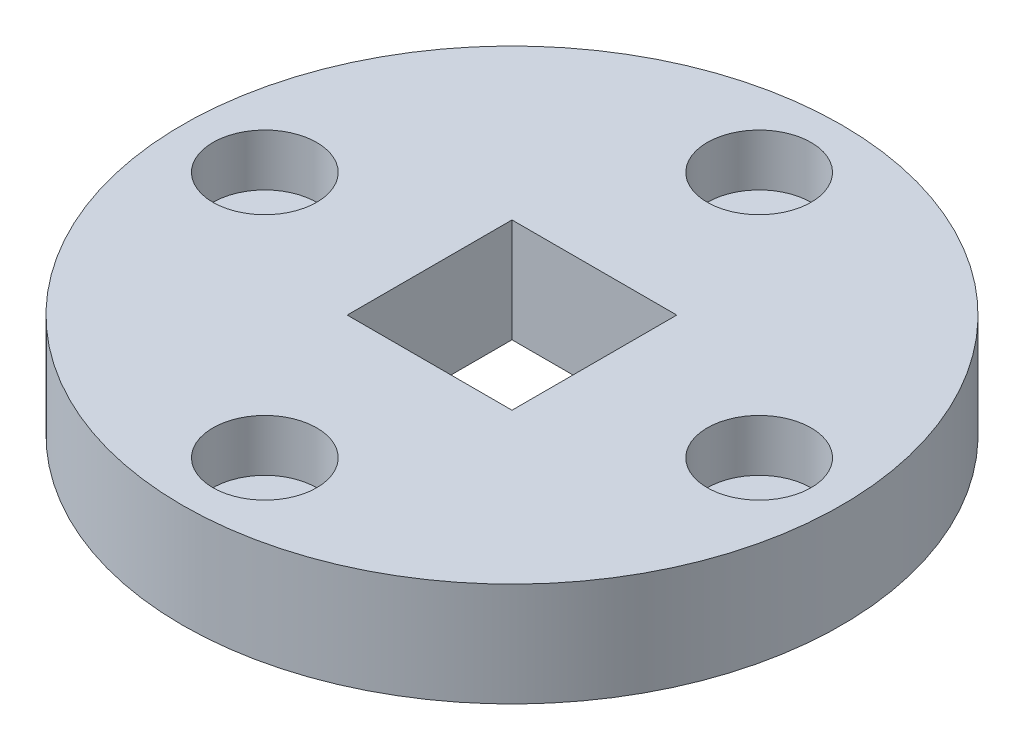
ISO-10303-21;
HEADER;
FILE_DESCRIPTION(('STEP AP214'),'2;1');
FILE_NAME('part.step','',(''),(''),'','','');
FILE_SCHEMA(('AUTOMOTIVE_DESIGN { 1 0 10303 214 1 1 1 1 }'));
ENDSEC;
DATA;
#1=APPLICATION_CONTEXT('core data for automotive mechanical design processes');
#2=APPLICATION_PROTOCOL_DEFINITION('international standard','automotive_design',2000,#1);
#3=PRODUCT_CONTEXT('',#1,'mechanical');
#4=PRODUCT('Part','Part','',(#3));
#5=PRODUCT_RELATED_PRODUCT_CATEGORY('part','',(#4));
#6=PRODUCT_DEFINITION_FORMATION('','',#4);
#7=PRODUCT_DEFINITION_CONTEXT('part definition',#1,'design');
#8=PRODUCT_DEFINITION('design','',#6,#7);
#9=PRODUCT_DEFINITION_SHAPE('','',#8);
#10=(LENGTH_UNIT() NAMED_UNIT(*) SI_UNIT(.MILLI.,.METRE.));
#11=(NAMED_UNIT(*) PLANE_ANGLE_UNIT() SI_UNIT($,.RADIAN.));
#12=(NAMED_UNIT(*) SI_UNIT($,.STERADIAN.) SOLID_ANGLE_UNIT());
#13=UNCERTAINTY_MEASURE_WITH_UNIT(LENGTH_MEASURE(1.E-05),#10,'distance_accuracy_value','');
#14=(GEOMETRIC_REPRESENTATION_CONTEXT(3) GLOBAL_UNCERTAINTY_ASSIGNED_CONTEXT((#13)) GLOBAL_UNIT_ASSIGNED_CONTEXT((#10,
#11,#12)) REPRESENTATION_CONTEXT('',''));
#15=CARTESIAN_POINT('',(0.,0.,0.));
#16=DIRECTION('',(0.,0.,1.));
#17=DIRECTION('',(1.,0.,0.));
#18=AXIS2_PLACEMENT_3D('',#15,#16,#17);
#19=CARTESIAN_POINT('',(0.,2.,0.));
#20=DIRECTION('',(0.,1.,0.));
#21=DIRECTION('',(0.,0.,1.));
#22=AXIS2_PLACEMENT_3D('',#19,#20,#21);
#23=PLANE('',#22);
#24=CARTESIAN_POINT('',(0.,2.,-4.7625));
#25=DIRECTION('',(0.,1.,0.));
#26=DIRECTION('',(-1.,0.,0.));
#27=AXIS2_PLACEMENT_3D('',#24,#25,#26);
#28=CIRCLE('',#27,1.);
#29=CARTESIAN_POINT('',(-0.999999999999984,2.,-4.7625));
#30=VERTEX_POINT('',#29);
#31=EDGE_CURVE('E236',#30,#30,#28,.T.);
#32=ORIENTED_EDGE('',*,*,#31,.F.);
#33=EDGE_LOOP('',(#32));
#34=FACE_BOUND('',#33,.T.);
#35=CARTESIAN_POINT('',(4.7625,2.,0.));
#36=DIRECTION('',(0.,1.,0.));
#37=DIRECTION('',(0.,0.,-1.));
#38=AXIS2_PLACEMENT_3D('',#35,#36,#37);
#39=CIRCLE('',#38,1.);
#40=CARTESIAN_POINT('',(4.7625,2.,-1.));
#41=VERTEX_POINT('',#40);
#42=EDGE_CURVE('E245',#41,#41,#39,.T.);
#43=ORIENTED_EDGE('',*,*,#42,.F.);
#44=EDGE_LOOP('',(#43));
#45=FACE_BOUND('',#44,.T.);
#46=CARTESIAN_POINT('',(0.,2.,4.7625));
#47=DIRECTION('',(0.,1.,0.));
#48=DIRECTION('',(1.,0.,0.));
#49=AXIS2_PLACEMENT_3D('',#46,#47,#48);
#50=CIRCLE('',#49,1.);
#51=CARTESIAN_POINT('',(0.99999999999995,2.,4.76250000000001));
#52=VERTEX_POINT('',#51);
#53=EDGE_CURVE('E251',#52,#52,#50,.T.);
#54=ORIENTED_EDGE('',*,*,#53,.F.);
#55=EDGE_LOOP('',(#54));
#56=FACE_BOUND('',#55,.T.);
#57=CARTESIAN_POINT('',(-4.7625,2.,0.));
#58=DIRECTION('',(0.,1.,0.));
#59=DIRECTION('',(0.,0.,1.));
#60=AXIS2_PLACEMENT_3D('',#57,#58,#59);
#61=CIRCLE('',#60,1.);
#62=CARTESIAN_POINT('',(-4.7625,2.,1.));
#63=VERTEX_POINT('',#62);
#64=EDGE_CURVE('E235',#63,#63,#61,.T.);
#65=ORIENTED_EDGE('',*,*,#64,.F.);
#66=EDGE_LOOP('',(#65));
#67=FACE_BOUND('',#66,.T.);
#68=CARTESIAN_POINT('',(0.,2.,0.));
#69=DIRECTION('',(0.,1.,0.));
#70=DIRECTION('',(0.,0.,1.));
#71=AXIS2_PLACEMENT_3D('',#68,#69,#70);
#72=CIRCLE('',#71,6.35);
#73=CARTESIAN_POINT('',(0.,2.,6.35));
#74=VERTEX_POINT('',#73);
#75=EDGE_CURVE('E11',#74,#74,#72,.T.);
#76=ORIENTED_EDGE('',*,*,#75,.T.);
#77=EDGE_LOOP('',(#76));
#78=FACE_BOUND('',#77,.T.);
#79=DIRECTION('',(-1.,0.,0.));
#80=VECTOR('',#79,1.);
#81=CARTESIAN_POINT('',(-1.5875,2.,-1.5875));
#82=LINE('',#81,#80);
#83=CARTESIAN_POINT('',(1.5875,2.,-1.5875));
#84=VERTEX_POINT('',#83);
#85=CARTESIAN_POINT('',(-1.5875,2.,-1.5875));
#86=VERTEX_POINT('',#85);
#87=EDGE_CURVE('E82',#84,#86,#82,.T.);
#88=ORIENTED_EDGE('',*,*,#87,.F.);
#89=DIRECTION('',(0.,0.,-1.));
#90=VECTOR('',#89,1.);
#91=CARTESIAN_POINT('',(1.5875,2.,1.5875));
#92=LINE('',#91,#90);
#93=CARTESIAN_POINT('',(1.5875,2.,1.5875));
#94=VERTEX_POINT('',#93);
#95=EDGE_CURVE('E74',#94,#84,#92,.T.);
#96=ORIENTED_EDGE('',*,*,#95,.F.);
#97=DIRECTION('',(1.,0.,0.));
#98=VECTOR('',#97,1.);
#99=CARTESIAN_POINT('',(-1.5875,2.,1.5875));
#100=LINE('',#99,#98);
#101=CARTESIAN_POINT('',(-1.5875,2.,1.5875));
#102=VERTEX_POINT('',#101);
#103=EDGE_CURVE('E95',#102,#94,#100,.T.);
#104=ORIENTED_EDGE('',*,*,#103,.F.);
#105=DIRECTION('',(0.,0.,1.));
#106=VECTOR('',#105,1.);
#107=CARTESIAN_POINT('',(-1.5875,2.,1.5875));
#108=LINE('',#107,#106);
#109=EDGE_CURVE('E93',#86,#102,#108,.T.);
#110=ORIENTED_EDGE('',*,*,#109,.F.);
#111=EDGE_LOOP('',(#88,#96,#104,#110));
#112=FACE_BOUND('',#111,.T.);
#113=ADVANCED_FACE('F33',(#34,#45,#56,#67,#78,#112),#23,.T.);
#114=CARTESIAN_POINT('',(0.,0.,0.));
#115=DIRECTION('',(0.,1.,0.));
#116=DIRECTION('',(0.,0.,1.));
#117=AXIS2_PLACEMENT_3D('',#114,#115,#116);
#118=PLANE('',#117);
#119=CARTESIAN_POINT('',(0.,0.,0.));
#120=DIRECTION('',(0.,1.,0.));
#121=DIRECTION('',(0.,0.,1.));
#122=AXIS2_PLACEMENT_3D('',#119,#120,#121);
#123=CIRCLE('',#122,6.35);
#124=CARTESIAN_POINT('',(0.,0.,6.35));
#125=VERTEX_POINT('',#124);
#126=EDGE_CURVE('E37',#125,#125,#123,.T.);
#127=ORIENTED_EDGE('',*,*,#126,.F.);
#128=EDGE_LOOP('',(#127));
#129=FACE_BOUND('',#128,.T.);
#130=DIRECTION('',(0.,0.,-1.));
#131=VECTOR('',#130,1.);
#132=CARTESIAN_POINT('',(1.5875,0.,1.5875));
#133=LINE('',#132,#131);
#134=CARTESIAN_POINT('',(1.5875,0.,1.5875));
#135=VERTEX_POINT('',#134);
#136=CARTESIAN_POINT('',(1.5875,0.,-1.5875));
#137=VERTEX_POINT('',#136);
#138=EDGE_CURVE('E56',#135,#137,#133,.T.);
#139=ORIENTED_EDGE('',*,*,#138,.T.);
#140=DIRECTION('',(-1.,0.,0.));
#141=VECTOR('',#140,1.);
#142=CARTESIAN_POINT('',(-1.5875,0.,-1.5875));
#143=LINE('',#142,#141);
#144=CARTESIAN_POINT('',(-1.5875,0.,-1.5875));
#145=VERTEX_POINT('',#144);
#146=EDGE_CURVE('E89',#137,#145,#143,.T.);
#147=ORIENTED_EDGE('',*,*,#146,.T.);
#148=DIRECTION('',(0.,0.,1.));
#149=VECTOR('',#148,1.);
#150=CARTESIAN_POINT('',(-1.5875,0.,1.5875));
#151=LINE('',#150,#149);
#152=CARTESIAN_POINT('',(-1.5875,0.,1.5875));
#153=VERTEX_POINT('',#152);
#154=EDGE_CURVE('E103',#145,#153,#151,.T.);
#155=ORIENTED_EDGE('',*,*,#154,.T.);
#156=DIRECTION('',(1.,0.,0.));
#157=VECTOR('',#156,1.);
#158=CARTESIAN_POINT('',(-1.5875,0.,1.5875));
#159=LINE('',#158,#157);
#160=EDGE_CURVE('E83',#153,#135,#159,.T.);
#161=ORIENTED_EDGE('',*,*,#160,.T.);
#162=EDGE_LOOP('',(#139,#147,#155,#161));
#163=FACE_BOUND('',#162,.T.);
#164=ADVANCED_FACE('F114',(#129,#163),#118,.F.);
#165=CARTESIAN_POINT('',(0.,2.,0.));
#166=DIRECTION('',(0.,-1.,0.));
#167=DIRECTION('',(0.,0.,-1.));
#168=AXIS2_PLACEMENT_3D('',#165,#166,#167);
#169=CYLINDRICAL_SURFACE('',#168,6.35);
#170=ORIENTED_EDGE('',*,*,#75,.F.);
#171=EDGE_LOOP('',(#170));
#172=FACE_BOUND('',#171,.T.);
#173=ORIENTED_EDGE('',*,*,#126,.T.);
#174=EDGE_LOOP('',(#173));
#175=FACE_BOUND('',#174,.T.);
#176=ADVANCED_FACE('F35',(#172,#175),#169,.T.);
#177=CARTESIAN_POINT('',(1.5875,2.,1.5875));
#178=DIRECTION('',(-1.,0.,0.));
#179=DIRECTION('',(0.,0.,1.));
#180=AXIS2_PLACEMENT_3D('',#177,#178,#179);
#181=PLANE('',#180);
#182=ORIENTED_EDGE('',*,*,#138,.F.);
#183=DIRECTION('',(0.,-1.,0.));
#184=VECTOR('',#183,1.);
#185=CARTESIAN_POINT('',(1.5875,2.,1.5875));
#186=LINE('',#185,#184);
#187=EDGE_CURVE('E78',#94,#135,#186,.T.);
#188=ORIENTED_EDGE('',*,*,#187,.F.);
#189=ORIENTED_EDGE('',*,*,#95,.T.);
#190=DIRECTION('',(0.,-1.,0.));
#191=VECTOR('',#190,1.);
#192=CARTESIAN_POINT('',(1.5875,2.,-1.5875));
#193=LINE('',#192,#191);
#194=EDGE_CURVE('E77',#84,#137,#193,.T.);
#195=ORIENTED_EDGE('',*,*,#194,.T.);
#196=EDGE_LOOP('',(#182,#188,#189,#195));
#197=FACE_BOUND('',#196,.T.);
#198=ADVANCED_FACE('F76',(#197),#181,.T.);
#199=CARTESIAN_POINT('',(-1.5875,2.,-1.5875));
#200=DIRECTION('',(0.,0.,1.));
#201=DIRECTION('',(1.,0.,0.));
#202=AXIS2_PLACEMENT_3D('',#199,#200,#201);
#203=PLANE('',#202);
#204=ORIENTED_EDGE('',*,*,#146,.F.);
#205=ORIENTED_EDGE('',*,*,#194,.F.);
#206=ORIENTED_EDGE('',*,*,#87,.T.);
#207=DIRECTION('',(0.,-1.,0.));
#208=VECTOR('',#207,1.);
#209=CARTESIAN_POINT('',(-1.5875,2.,-1.5875));
#210=LINE('',#209,#208);
#211=EDGE_CURVE('E90',#86,#145,#210,.T.);
#212=ORIENTED_EDGE('',*,*,#211,.T.);
#213=EDGE_LOOP('',(#204,#205,#206,#212));
#214=FACE_BOUND('',#213,.T.);
#215=ADVANCED_FACE('F86',(#214),#203,.T.);
#216=CARTESIAN_POINT('',(-1.5875,2.,1.5875));
#217=DIRECTION('',(1.,0.,0.));
#218=DIRECTION('',(0.,0.,-1.));
#219=AXIS2_PLACEMENT_3D('',#216,#217,#218);
#220=PLANE('',#219);
#221=ORIENTED_EDGE('',*,*,#154,.F.);
#222=ORIENTED_EDGE('',*,*,#211,.F.);
#223=ORIENTED_EDGE('',*,*,#109,.T.);
#224=DIRECTION('',(0.,-1.,0.));
#225=VECTOR('',#224,1.);
#226=CARTESIAN_POINT('',(-1.5875,2.,1.5875));
#227=LINE('',#226,#225);
#228=EDGE_CURVE('E48',#102,#153,#227,.T.);
#229=ORIENTED_EDGE('',*,*,#228,.T.);
#230=EDGE_LOOP('',(#221,#222,#223,#229));
#231=FACE_BOUND('',#230,.T.);
#232=ADVANCED_FACE('F112',(#231),#220,.T.);
#233=CARTESIAN_POINT('',(-1.5875,2.,1.5875));
#234=DIRECTION('',(0.,0.,-1.));
#235=DIRECTION('',(-1.,0.,0.));
#236=AXIS2_PLACEMENT_3D('',#233,#234,#235);
#237=PLANE('',#236);
#238=ORIENTED_EDGE('',*,*,#160,.F.);
#239=ORIENTED_EDGE('',*,*,#228,.F.);
#240=ORIENTED_EDGE('',*,*,#103,.T.);
#241=ORIENTED_EDGE('',*,*,#187,.T.);
#242=EDGE_LOOP('',(#238,#239,#240,#241));
#243=FACE_BOUND('',#242,.T.);
#244=ADVANCED_FACE('F115',(#243),#237,.T.);
#245=CARTESIAN_POINT('',(-4.7625,1.,0.));
#246=DIRECTION('',(0.,1.,0.));
#247=DIRECTION('',(0.,0.,1.));
#248=AXIS2_PLACEMENT_3D('',#245,#246,#247);
#249=CYLINDRICAL_SURFACE('',#248,1.);
#250=CARTESIAN_POINT('',(-4.7625,1.,0.));
#251=DIRECTION('',(0.,1.,0.));
#252=DIRECTION('',(0.,0.,1.));
#253=AXIS2_PLACEMENT_3D('',#250,#251,#252);
#254=CIRCLE('',#253,1.);
#255=CARTESIAN_POINT('',(-4.7625,1.,1.));
#256=VERTEX_POINT('',#255);
#257=EDGE_CURVE('E101',#256,#256,#254,.T.);
#258=ORIENTED_EDGE('',*,*,#257,.F.);
#259=EDGE_LOOP('',(#258));
#260=FACE_BOUND('',#259,.T.);
#261=ORIENTED_EDGE('',*,*,#64,.T.);
#262=EDGE_LOOP('',(#261));
#263=FACE_BOUND('',#262,.T.);
#264=ADVANCED_FACE('F117',(#260,#263),#249,.F.);
#265=CARTESIAN_POINT('',(-4.7625,1.,0.));
#266=DIRECTION('',(0.,1.,0.));
#267=DIRECTION('',(0.,0.,1.));
#268=AXIS2_PLACEMENT_3D('',#265,#266,#267);
#269=PLANE('',#268);
#270=ORIENTED_EDGE('',*,*,#257,.T.);
#271=EDGE_LOOP('',(#270));
#272=FACE_BOUND('',#271,.T.);
#273=ADVANCED_FACE('F123',(#272),#269,.T.);
#274=CARTESIAN_POINT('',(0.,1.,4.7625));
#275=DIRECTION('',(0.,1.,0.));
#276=DIRECTION('',(0.,0.,1.));
#277=AXIS2_PLACEMENT_3D('',#274,#275,#276);
#278=CYLINDRICAL_SURFACE('',#277,1.);
#279=CARTESIAN_POINT('',(0.,1.,4.7625));
#280=DIRECTION('',(0.,1.,0.));
#281=DIRECTION('',(1.,0.,0.));
#282=AXIS2_PLACEMENT_3D('',#279,#280,#281);
#283=CIRCLE('',#282,1.);
#284=CARTESIAN_POINT('',(0.99999999999995,1.,4.76250000000001));
#285=VERTEX_POINT('',#284);
#286=EDGE_CURVE('E248',#285,#285,#283,.T.);
#287=ORIENTED_EDGE('',*,*,#286,.F.);
#288=EDGE_LOOP('',(#287));
#289=FACE_BOUND('',#288,.T.);
#290=ORIENTED_EDGE('',*,*,#53,.T.);
#291=EDGE_LOOP('',(#290));
#292=FACE_BOUND('',#291,.T.);
#293=ADVANCED_FACE('F168',(#289,#292),#278,.F.);
#294=CARTESIAN_POINT('',(0.,1.,4.7625));
#295=DIRECTION('',(0.,1.,0.));
#296=DIRECTION('',(1.,0.,0.));
#297=AXIS2_PLACEMENT_3D('',#294,#295,#296);
#298=PLANE('',#297);
#299=ORIENTED_EDGE('',*,*,#286,.T.);
#300=EDGE_LOOP('',(#299));
#301=FACE_BOUND('',#300,.T.);
#302=ADVANCED_FACE('F178',(#301),#298,.T.);
#303=CARTESIAN_POINT('',(4.7625,1.,0.));
#304=DIRECTION('',(0.,1.,0.));
#305=DIRECTION('',(0.,0.,1.));
#306=AXIS2_PLACEMENT_3D('',#303,#304,#305);
#307=CYLINDRICAL_SURFACE('',#306,1.);
#308=CARTESIAN_POINT('',(4.7625,1.,0.));
#309=DIRECTION('',(0.,1.,0.));
#310=DIRECTION('',(0.,0.,-1.));
#311=AXIS2_PLACEMENT_3D('',#308,#309,#310);
#312=CIRCLE('',#311,1.);
#313=CARTESIAN_POINT('',(4.7625,1.,-1.));
#314=VERTEX_POINT('',#313);
#315=EDGE_CURVE('E240',#314,#314,#312,.T.);
#316=ORIENTED_EDGE('',*,*,#315,.F.);
#317=EDGE_LOOP('',(#316));
#318=FACE_BOUND('',#317,.T.);
#319=ORIENTED_EDGE('',*,*,#42,.T.);
#320=EDGE_LOOP('',(#319));
#321=FACE_BOUND('',#320,.T.);
#322=ADVANCED_FACE('F185',(#318,#321),#307,.F.);
#323=CARTESIAN_POINT('',(4.7625,1.,0.));
#324=DIRECTION('',(0.,1.,0.));
#325=DIRECTION('',(0.,0.,-1.));
#326=AXIS2_PLACEMENT_3D('',#323,#324,#325);
#327=PLANE('',#326);
#328=ORIENTED_EDGE('',*,*,#315,.T.);
#329=EDGE_LOOP('',(#328));
#330=FACE_BOUND('',#329,.T.);
#331=ADVANCED_FACE('F193',(#330),#327,.T.);
#332=CARTESIAN_POINT('',(0.,1.,-4.7625));
#333=DIRECTION('',(0.,1.,0.));
#334=DIRECTION('',(0.,0.,1.));
#335=AXIS2_PLACEMENT_3D('',#332,#333,#334);
#336=CYLINDRICAL_SURFACE('',#335,1.);
#337=CARTESIAN_POINT('',(0.,1.,-4.7625));
#338=DIRECTION('',(0.,1.,0.));
#339=DIRECTION('',(-1.,0.,0.));
#340=AXIS2_PLACEMENT_3D('',#337,#338,#339);
#341=CIRCLE('',#340,1.);
#342=CARTESIAN_POINT('',(-0.999999999999984,1.,-4.7625));
#343=VERTEX_POINT('',#342);
#344=EDGE_CURVE('E234',#343,#343,#341,.T.);
#345=ORIENTED_EDGE('',*,*,#344,.F.);
#346=EDGE_LOOP('',(#345));
#347=FACE_BOUND('',#346,.T.);
#348=ORIENTED_EDGE('',*,*,#31,.T.);
#349=EDGE_LOOP('',(#348));
#350=FACE_BOUND('',#349,.T.);
#351=ADVANCED_FACE('F201',(#347,#350),#336,.F.);
#352=CARTESIAN_POINT('',(0.,1.,-4.7625));
#353=DIRECTION('',(0.,1.,0.));
#354=DIRECTION('',(-1.,0.,0.));
#355=AXIS2_PLACEMENT_3D('',#352,#353,#354);
#356=PLANE('',#355);
#357=ORIENTED_EDGE('',*,*,#344,.T.);
#358=EDGE_LOOP('',(#357));
#359=FACE_BOUND('',#358,.T.);
#360=ADVANCED_FACE('F209',(#359),#356,.T.);
#361=CLOSED_SHELL('',(#113,#164,#176,#198,#215,#232,#244,#264,#273,#293,#302,#322,#331,#351,#360));
#362=MANIFOLD_SOLID_BREP('B2',#361);
#363=ADVANCED_BREP_SHAPE_REPRESENTATION('',(#18,#362),#14);
#364=SHAPE_DEFINITION_REPRESENTATION(#9,#363);
ENDSEC;
END-ISO-10303-21;
